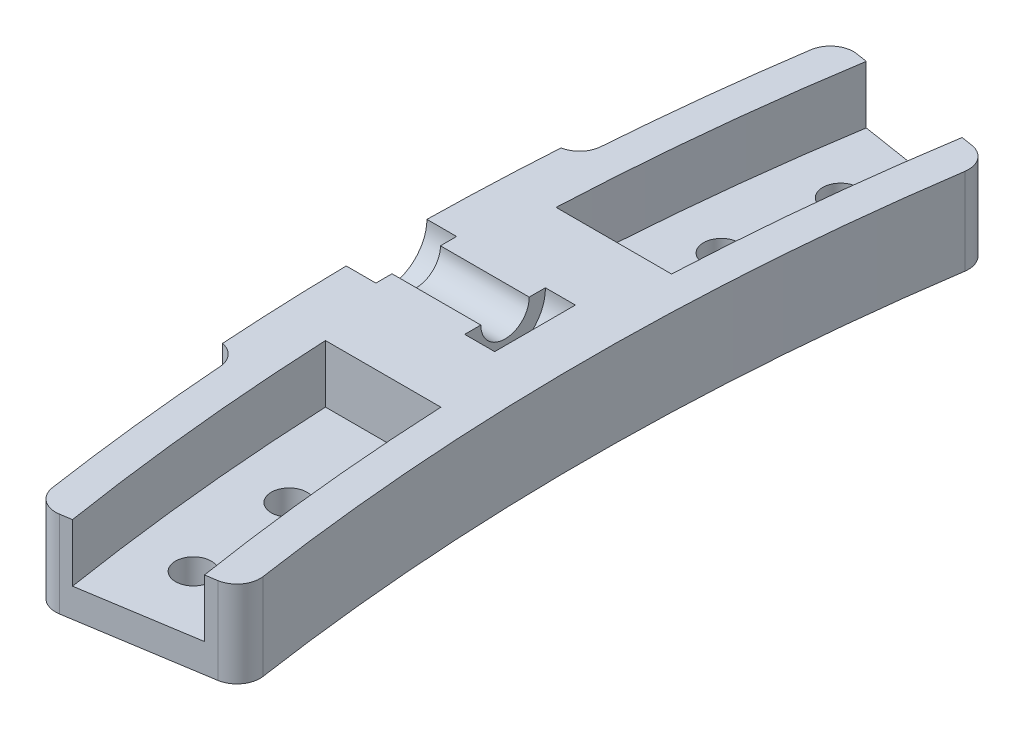
ISO-10303-21;
HEADER;
FILE_DESCRIPTION(('STEP AP214'),'2;1');
FILE_NAME('part.step','',(''),(''),'','','');
FILE_SCHEMA(('AUTOMOTIVE_DESIGN { 1 0 10303 214 1 1 1 1 }'));
ENDSEC;
DATA;
#1=APPLICATION_CONTEXT('core data for automotive mechanical design processes');
#2=APPLICATION_PROTOCOL_DEFINITION('international standard','automotive_design',2000,#1);
#3=PRODUCT_CONTEXT('',#1,'mechanical');
#4=PRODUCT('Part','Part','',(#3));
#5=PRODUCT_RELATED_PRODUCT_CATEGORY('part','',(#4));
#6=PRODUCT_DEFINITION_FORMATION('','',#4);
#7=PRODUCT_DEFINITION_CONTEXT('part definition',#1,'design');
#8=PRODUCT_DEFINITION('design','',#6,#7);
#9=PRODUCT_DEFINITION_SHAPE('','',#8);
#10=(LENGTH_UNIT() NAMED_UNIT(*) SI_UNIT(.MILLI.,.METRE.));
#11=(NAMED_UNIT(*) PLANE_ANGLE_UNIT() SI_UNIT($,.RADIAN.));
#12=(NAMED_UNIT(*) SI_UNIT($,.STERADIAN.) SOLID_ANGLE_UNIT());
#13=UNCERTAINTY_MEASURE_WITH_UNIT(LENGTH_MEASURE(1.E-05),#10,'distance_accuracy_value','');
#14=(GEOMETRIC_REPRESENTATION_CONTEXT(3) GLOBAL_UNCERTAINTY_ASSIGNED_CONTEXT((#13)) GLOBAL_UNIT_ASSIGNED_CONTEXT((#10,
#11,#12)) REPRESENTATION_CONTEXT('',''));
#15=CARTESIAN_POINT('',(0.,0.,0.));
#16=DIRECTION('',(0.,0.,1.));
#17=DIRECTION('',(1.,0.,0.));
#18=AXIS2_PLACEMENT_3D('',#15,#16,#17);
#19=CARTESIAN_POINT('',(0.,7.5,0.));
#20=DIRECTION('',(0.,1.,0.));
#21=DIRECTION('',(0.,0.,1.));
#22=AXIS2_PLACEMENT_3D('',#19,#20,#21);
#23=PLANE('',#22);
#24=CARTESIAN_POINT('',(0.,7.5,0.));
#25=DIRECTION('',(0.,1.,0.));
#26=DIRECTION('',(0.,0.,1.));
#27=AXIS2_PLACEMENT_3D('',#24,#25,#26);
#28=CIRCLE('',#27,224.5);
#29=CARTESIAN_POINT('',(-224.019328267066,7.5,-14.6830025121671));
#30=VERTEX_POINT('',#29);
#31=CARTESIAN_POINT('',(-224.472715491215,7.5,-3.5));
#32=VERTEX_POINT('',#31);
#33=EDGE_CURVE('E327',#30,#32,#28,.T.);
#34=ORIENTED_EDGE('',*,*,#33,.T.);
#35=DIRECTION('',(-1.,0.,0.));
#36=VECTOR('',#35,1.);
#37=CARTESIAN_POINT('',(-224.5,7.5,-3.5));
#38=LINE('',#37,#36);
#39=CARTESIAN_POINT('',(-221.9,7.5,-3.5));
#40=VERTEX_POINT('',#39);
#41=EDGE_CURVE('E220',#32,#40,#38,.F.);
#42=ORIENTED_EDGE('',*,*,#41,.T.);
#43=DIRECTION('',(0.,0.,1.));
#44=VECTOR('',#43,1.);
#45=CARTESIAN_POINT('',(-221.9,7.5,0.));
#46=LINE('',#45,#44);
#47=CARTESIAN_POINT('',(-221.9,7.5,-2.10000000000001));
#48=VERTEX_POINT('',#47);
#49=EDGE_CURVE('E221',#40,#48,#46,.T.);
#50=ORIENTED_EDGE('',*,*,#49,.T.);
#51=DIRECTION('',(1.,0.,0.));
#52=VECTOR('',#51,1.);
#53=CARTESIAN_POINT('',(-224.5,7.5,-2.10000000000001));
#54=LINE('',#53,#52);
#55=CARTESIAN_POINT('',(-214.200000000001,7.5,-2.10000000000001));
#56=VERTEX_POINT('',#55);
#57=EDGE_CURVE('E242',#56,#48,#54,.F.);
#58=ORIENTED_EDGE('',*,*,#57,.F.);
#59=DIRECTION('',(0.,0.,1.));
#60=VECTOR('',#59,1.);
#61=CARTESIAN_POINT('',(-214.2,7.5,5.26399215997816E-12));
#62=LINE('',#61,#60);
#63=CARTESIAN_POINT('',(-214.200000000001,7.5,-3.49947186729268));
#64=VERTEX_POINT('',#63);
#65=EDGE_CURVE('E241',#64,#56,#62,.T.);
#66=ORIENTED_EDGE('',*,*,#65,.F.);
#67=DIRECTION('',(1.,0.,0.));
#68=VECTOR('',#67,1.);
#69=CARTESIAN_POINT('',(-214.200000000001,7.5,-3.49947186729268));
#70=LINE('',#69,#68);
#71=CARTESIAN_POINT('',(-211.600000000001,7.5,-3.49947186729274));
#72=VERTEX_POINT('',#71);
#73=EDGE_CURVE('E424',#64,#72,#70,.T.);
#74=ORIENTED_EDGE('',*,*,#73,.T.);
#75=DIRECTION('',(0.,0.,1.));
#76=VECTOR('',#75,1.);
#77=CARTESIAN_POINT('',(-211.6,7.5,5.20009683030522E-12));
#78=LINE('',#77,#76);
#79=CARTESIAN_POINT('',(-211.6,7.5,3.49947186730315));
#80=VERTEX_POINT('',#79);
#81=EDGE_CURVE('E416',#72,#80,#78,.T.);
#82=ORIENTED_EDGE('',*,*,#81,.T.);
#83=DIRECTION('',(1.,0.,0.));
#84=VECTOR('',#83,1.);
#85=CARTESIAN_POINT('',(-214.2,7.5,3.49947186730321));
#86=LINE('',#85,#84);
#87=CARTESIAN_POINT('',(-214.2,7.5,3.49947186730321));
#88=VERTEX_POINT('',#87);
#89=EDGE_CURVE('E421',#80,#88,#86,.F.);
#90=ORIENTED_EDGE('',*,*,#89,.T.);
#91=CARTESIAN_POINT('',(-214.2,7.5,2.09999999999999));
#92=VERTEX_POINT('',#91);
#93=EDGE_CURVE('E237',#92,#88,#62,.T.);
#94=ORIENTED_EDGE('',*,*,#93,.F.);
#95=DIRECTION('',(1.,0.,0.));
#96=VECTOR('',#95,1.);
#97=CARTESIAN_POINT('',(-224.5,7.5,2.09999999999999));
#98=LINE('',#97,#96);
#99=CARTESIAN_POINT('',(-221.9,7.5,2.09999999999999));
#100=VERTEX_POINT('',#99);
#101=EDGE_CURVE('E229',#100,#92,#98,.T.);
#102=ORIENTED_EDGE('',*,*,#101,.F.);
#103=CARTESIAN_POINT('',(-221.9,7.5,3.49999999999995));
#104=VERTEX_POINT('',#103);
#105=EDGE_CURVE('E56',#100,#104,#46,.T.);
#106=ORIENTED_EDGE('',*,*,#105,.T.);
#107=DIRECTION('',(-1.,0.,0.));
#108=VECTOR('',#107,1.);
#109=CARTESIAN_POINT('',(-224.5,7.5,3.49999999999995));
#110=LINE('',#109,#108);
#111=CARTESIAN_POINT('',(-224.472715491215,7.5,3.49999999999995));
#112=VERTEX_POINT('',#111);
#113=EDGE_CURVE('E214',#104,#112,#110,.T.);
#114=ORIENTED_EDGE('',*,*,#113,.T.);
#115=CARTESIAN_POINT('',(-224.019328267066,7.5,14.6830025121672));
#116=VERTEX_POINT('',#115);
#117=EDGE_CURVE('E330',#112,#116,#28,.T.);
#118=ORIENTED_EDGE('',*,*,#117,.T.);
#119=CARTESIAN_POINT('',(-224.383131319015,7.5,16.6496360162551));
#120=DIRECTION('',(0.,1.,0.));
#121=DIRECTION('',(0.,0.,1.));
#122=AXIS2_PLACEMENT_3D('',#119,#120,#121);
#123=CIRCLE('',#122,2.);
#124=CARTESIAN_POINT('',(-222.388614596179,7.5,16.5016392516661));
#125=VERTEX_POINT('',#124);
#126=EDGE_CURVE('E64',#116,#125,#123,.F.);
#127=ORIENTED_EDGE('',*,*,#126,.T.);
#128=CARTESIAN_POINT('',(0.,7.5,0.));
#129=DIRECTION('',(0.,1.,0.));
#130=DIRECTION('',(0.,0.,1.));
#131=AXIS2_PLACEMENT_3D('',#128,#129,#130);
#132=CIRCLE('',#131,223.);
#133=CARTESIAN_POINT('',(-220.561180845032,7.5,32.8902037732362));
#134=VERTEX_POINT('',#133);
#135=EDGE_CURVE('E348',#125,#134,#132,.T.);
#136=ORIENTED_EDGE('',*,*,#135,.T.);
#137=CARTESIAN_POINT('',(-218.583053662566,7.5,32.5952243671982));
#138=DIRECTION('',(0.,1.,0.));
#139=DIRECTION('',(0.,0.,1.));
#140=AXIS2_PLACEMENT_3D('',#137,#138,#139);
#141=CIRCLE('',#140,2.);
#142=CARTESIAN_POINT('',(-218.270184732485,7.5,34.5706010483885));
#143=VERTEX_POINT('',#142);
#144=EDGE_CURVE('E383',#134,#143,#141,.T.);
#145=ORIENTED_EDGE('',*,*,#144,.T.);
#146=DIRECTION('',(-0.987688340595137,0.,0.156434465040234));
#147=VECTOR('',#146,1.);
#148=CARTESIAN_POINT('',(0.,7.5,0.));
#149=LINE('',#148,#147);
#150=CARTESIAN_POINT('',(-217.29143493093,7.5,34.4155823088514));
#151=VERTEX_POINT('',#150);
#152=EDGE_CURVE('E342',#151,#143,#149,.T.);
#153=ORIENTED_EDGE('',*,*,#152,.F.);
#154=CARTESIAN_POINT('',(0.,7.5,0.));
#155=DIRECTION('',(0.,1.,0.));
#156=DIRECTION('',(0.,0.,1.));
#157=AXIS2_PLACEMENT_3D('',#154,#155,#156);
#158=CIRCLE('',#157,220.);
#159=CARTESIAN_POINT('',(-219.772609758359,7.5,10.));
#160=VERTEX_POINT('',#159);
#161=EDGE_CURVE('E314',#160,#151,#158,.T.);
#162=ORIENTED_EDGE('',*,*,#161,.F.);
#163=DIRECTION('',(-1.,0.,0.));
#164=VECTOR('',#163,1.);
#165=CARTESIAN_POINT('',(0.,7.5,10.));
#166=LINE('',#165,#164);
#167=CARTESIAN_POINT('',(-209.76176963403,7.5,10.));
#168=VERTEX_POINT('',#167);
#169=EDGE_CURVE('E312',#168,#160,#166,.T.);
#170=ORIENTED_EDGE('',*,*,#169,.F.);
#171=CARTESIAN_POINT('',(0.,7.5,0.));
#172=DIRECTION('',(0.,1.,0.));
#173=DIRECTION('',(0.,0.,1.));
#174=AXIS2_PLACEMENT_3D('',#171,#172,#173);
#175=CIRCLE('',#174,210.);
#176=CARTESIAN_POINT('',(-207.414551524979,7.5,32.8512376584491));
#177=VERTEX_POINT('',#176);
#178=EDGE_CURVE('E303',#168,#177,#175,.T.);
#179=ORIENTED_EDGE('',*,*,#178,.T.);
#180=CARTESIAN_POINT('',(-206.417411404929,7.5,32.6933061786099));
#181=VERTEX_POINT('',#180);
#182=EDGE_CURVE('E339',#181,#177,#149,.T.);
#183=ORIENTED_EDGE('',*,*,#182,.F.);
#184=CARTESIAN_POINT('',(-206.730280335009,7.5,30.7179294974196));
#185=DIRECTION('',(0.,1.,0.));
#186=DIRECTION('',(0.,0.,1.));
#187=AXIS2_PLACEMENT_3D('',#184,#185,#186);
#188=CIRCLE('',#187,2.);
#189=CARTESIAN_POINT('',(-204.752000140416,7.5,30.4239780189754));
#190=VERTEX_POINT('',#189);
#191=EDGE_CURVE('E385',#181,#190,#188,.T.);
#192=ORIENTED_EDGE('',*,*,#191,.T.);
#193=CARTESIAN_POINT('',(0.,7.5,0.));
#194=DIRECTION('',(0.,1.,0.));
#195=DIRECTION('',(0.,0.,1.));
#196=AXIS2_PLACEMENT_3D('',#193,#194,#195);
#197=CIRCLE('',#196,207.);
#198=CARTESIAN_POINT('',(-204.752000140416,7.5,-30.4239780189754));
#199=VERTEX_POINT('',#198);
#200=EDGE_CURVE('E341',#199,#190,#197,.T.);
#201=ORIENTED_EDGE('',*,*,#200,.F.);
#202=CARTESIAN_POINT('',(-206.730280335009,7.5,-30.7179294974196));
#203=DIRECTION('',(0.,1.,0.));
#204=DIRECTION('',(0.,0.,1.));
#205=AXIS2_PLACEMENT_3D('',#202,#203,#204);
#206=CIRCLE('',#205,2.);
#207=CARTESIAN_POINT('',(-206.417411404929,7.5,-32.6933061786099));
#208=VERTEX_POINT('',#207);
#209=EDGE_CURVE('E387',#199,#208,#206,.T.);
#210=ORIENTED_EDGE('',*,*,#209,.T.);
#211=DIRECTION('',(0.987688340595137,0.,0.156434465040234));
#212=VECTOR('',#211,1.);
#213=CARTESIAN_POINT('',(0.,7.5,0.));
#214=LINE('',#213,#212);
#215=CARTESIAN_POINT('',(-207.414551524979,7.5,-32.8512376584492));
#216=VERTEX_POINT('',#215);
#217=EDGE_CURVE('E345',#216,#208,#214,.T.);
#218=ORIENTED_EDGE('',*,*,#217,.F.);
#219=CARTESIAN_POINT('',(0.,7.5,0.));
#220=DIRECTION('',(0.,1.,0.));
#221=DIRECTION('',(0.,0.,1.));
#222=AXIS2_PLACEMENT_3D('',#219,#220,#221);
#223=CIRCLE('',#222,210.);
#224=CARTESIAN_POINT('',(-209.76176963403,7.5,-9.99999999999998));
#225=VERTEX_POINT('',#224);
#226=EDGE_CURVE('E272',#216,#225,#223,.T.);
#227=ORIENTED_EDGE('',*,*,#226,.T.);
#228=DIRECTION('',(-1.,0.,0.));
#229=VECTOR('',#228,1.);
#230=CARTESIAN_POINT('',(0.,7.5,-10.));
#231=LINE('',#230,#229);
#232=CARTESIAN_POINT('',(-219.772609758359,7.5,-9.99999999999997));
#233=VERTEX_POINT('',#232);
#234=EDGE_CURVE('E283',#225,#233,#231,.T.);
#235=ORIENTED_EDGE('',*,*,#234,.T.);
#236=CARTESIAN_POINT('',(0.,7.5,0.));
#237=DIRECTION('',(0.,1.,0.));
#238=DIRECTION('',(0.,0.,1.));
#239=AXIS2_PLACEMENT_3D('',#236,#237,#238);
#240=CIRCLE('',#239,220.);
#241=CARTESIAN_POINT('',(-217.29143493093,7.5,-34.4155823088514));
#242=VERTEX_POINT('',#241);
#243=EDGE_CURVE('E280',#242,#233,#240,.T.);
#244=ORIENTED_EDGE('',*,*,#243,.F.);
#245=CARTESIAN_POINT('',(-218.270184732485,7.5,-34.5706010483885));
#246=VERTEX_POINT('',#245);
#247=EDGE_CURVE('E346',#246,#242,#214,.T.);
#248=ORIENTED_EDGE('',*,*,#247,.F.);
#249=CARTESIAN_POINT('',(-218.583053662566,7.5,-32.5952243671982));
#250=DIRECTION('',(0.,1.,0.));
#251=DIRECTION('',(0.,0.,1.));
#252=AXIS2_PLACEMENT_3D('',#249,#250,#251);
#253=CIRCLE('',#252,2.);
#254=CARTESIAN_POINT('',(-220.561180845032,7.5,-32.8902037732362));
#255=VERTEX_POINT('',#254);
#256=EDGE_CURVE('E389',#246,#255,#253,.T.);
#257=ORIENTED_EDGE('',*,*,#256,.T.);
#258=CARTESIAN_POINT('',(-222.388614596179,7.5,-16.5016392516641));
#259=VERTEX_POINT('',#258);
#260=EDGE_CURVE('E349',#255,#259,#132,.T.);
#261=ORIENTED_EDGE('',*,*,#260,.T.);
#262=CARTESIAN_POINT('',(-224.383131319015,7.5,-16.649636016253));
#263=DIRECTION('',(0.,1.,0.));
#264=DIRECTION('',(0.,0.,1.));
#265=AXIS2_PLACEMENT_3D('',#262,#263,#264);
#266=CIRCLE('',#265,2.);
#267=EDGE_CURVE('E411',#259,#30,#266,.F.);
#268=ORIENTED_EDGE('',*,*,#267,.T.);
#269=EDGE_LOOP('',(#34,#42,#50,#58,#66,#74,#82,#90,#94,#102,#106,#114,#118,#127,#136,#145,#153,
#162,#170,#179,#183,#192,#201,#210,#218,#227,#235,#244,#248,#257,#261,#268));
#270=FACE_BOUND('',#269,.T.);
#271=ADVANCED_FACE('F35',(#270),#23,.T.);
#272=CARTESIAN_POINT('',(0.,7.5,0.));
#273=DIRECTION('',(0.,-1.,0.));
#274=DIRECTION('',(0.,0.,-1.));
#275=AXIS2_PLACEMENT_3D('',#272,#273,#274);
#276=CYLINDRICAL_SURFACE('',#275,224.5);
#277=CARTESIAN_POINT('',(-224.472715491215,7.5,-3.5));
#278=CARTESIAN_POINT('',(-224.472714861712,7.40156578840338,-3.50000943737716));
#279=CARTESIAN_POINT('',(-224.472780225117,7.30313605810773,-3.49584747938354));
#280=CARTESIAN_POINT('',(-224.473038289765,7.1069809173122,-3.47925381156051));
#281=CARTESIAN_POINT('',(-224.473230984854,7.00925547300403,-3.46682250139931));
#282=CARTESIAN_POINT('',(-224.473738885951,6.8152632798036,-3.43377485265587));
#283=CARTESIAN_POINT('',(-224.474054005164,6.71899554756869,-3.41316431264958));
#284=CARTESIAN_POINT('',(-224.474797261434,6.52856227230528,-3.36392550562658));
#285=CARTESIAN_POINT('',(-224.475225397129,6.43439670394645,-3.33529733527587));
#286=CARTESIAN_POINT('',(-224.476662783917,6.15596524404037,-3.23761897666636));
#287=CARTESIAN_POINT('',(-224.477825245954,5.97568200368354,-3.15676079513716));
#288=CARTESIAN_POINT('',(-224.480426703749,5.63138518923722,-2.96598425473683));
#289=CARTESIAN_POINT('',(-224.48186564567,5.46736845712206,-2.85607155183975));
#290=CARTESIAN_POINT('',(-224.484858395544,5.16006978767687,-2.61025296217331));
#291=CARTESIAN_POINT('',(-224.486412214712,5.01678987859334,-2.47434453580414));
#292=CARTESIAN_POINT('',(-224.489459632982,4.75506499986371,-2.18038409126836));
#293=CARTESIAN_POINT('',(-224.490953222877,4.63662381547568,-2.02232870416418));
#294=CARTESIAN_POINT('',(-224.493711562528,4.42795602564903,-1.68857247177381));
#295=CARTESIAN_POINT('',(-224.494976310728,4.33772961211474,-1.51287150648099));
#296=CARTESIAN_POINT('',(-224.497134279755,4.18806213664848,-1.14882485480166));
#297=CARTESIAN_POINT('',(-224.498027524533,4.12861909003653,-0.960479984483705));
#298=CARTESIAN_POINT('',(-224.499341856259,4.04220007556948,-0.576494033295444));
#299=CARTESIAN_POINT('',(-224.499762972449,4.01522209692809,-0.380853405075797));
#300=CARTESIAN_POINT('',(-224.500085673098,3.99449295010015,0.0121851581695343));
#301=CARTESIAN_POINT('',(-224.499987245918,4.00074252625487,0.209583132463209));
#302=CARTESIAN_POINT('',(-224.499281965034,4.04629033944203,0.600508238712191));
#303=CARTESIAN_POINT('',(-224.498675160583,4.08558537482803,0.794035743802673));
#304=CARTESIAN_POINT('',(-224.497021592075,4.1961036468751,1.17174593250207));
#305=CARTESIAN_POINT('',(-224.495974829285,4.2673267915241,1.35592864303959));
#306=CARTESIAN_POINT('',(-224.493559239443,4.43968478895615,1.70973551861152));
#307=CARTESIAN_POINT('',(-224.492190389736,4.54082174598735,1.87935865838854));
#308=CARTESIAN_POINT('',(-224.489285031404,4.77012988756459,2.19921078253235));
#309=CARTESIAN_POINT('',(-224.487748530898,4.89829976292092,2.34944070553442));
#310=CARTESIAN_POINT('',(-224.484681028317,5.17803246732865,2.62624976845429));
#311=CARTESIAN_POINT('',(-224.483150026089,5.32959464646475,2.75282956523463));
#312=CARTESIAN_POINT('',(-224.480265583076,5.65187883091554,2.97878840736272));
#313=CARTESIAN_POINT('',(-224.478912198826,5.82260690456416,3.07815880318588));
#314=CARTESIAN_POINT('',(-224.476535449462,6.17839774925335,3.24687297259607));
#315=CARTESIAN_POINT('',(-224.475512286168,6.36346920112557,3.31619839255343));
#316=CARTESIAN_POINT('',(-224.473914065314,6.74248187923013,3.4226871967959));
#317=CARTESIAN_POINT('',(-224.473338323597,6.93640908134263,3.45989969487161));
#318=CARTESIAN_POINT('',(-224.472916934368,7.19302192271803,3.48705818759328));
#319=CARTESIAN_POINT('',(-224.472841431698,7.25437105769747,3.49191392810576));
#320=CARTESIAN_POINT('',(-224.472740777511,7.37713851009347,3.49838040408815));
#321=CARTESIAN_POINT('',(-224.472715542936,7.4385565453343,3.49999649249394));
#322=CARTESIAN_POINT('',(-224.472715491215,7.5,3.49999999999995));
#323=B_SPLINE_CURVE_WITH_KNOTS('',3,(#277,#278,#279,#280,#281,#282,#283,#284,#285,#286,#287,
#288,#289,#290,#291,#292,#293,#294,#295,#296,#297,#298,#299,#300,#301,#302,#303,#304,#305,#306,
#307,#308,#309,#310,#311,#312,#313,#314,#315,#316,#317,#318,#319,#320,#321,#322),.UNSPECIFIED.,
.F.,.F.,(4,2,2,2,2,2,2,2,2,2,2,2,2,2,2,2,2,2,2,2,2,2,4),(0.,0.29520657625106,0.590398885833,
0.885382294826047,1.18036214745175,1.77007362886811,2.35967039699536,2.94932479403663,
3.53906898533124,4.12881718771663,4.71852736283831,5.30820101124837,5.89788786918531,
6.48751760122972,7.07714563405961,7.6668151533735,8.25645612186404,8.84608071113289,
9.43589251757687,10.0260641173299,10.6153314954947,10.7998949857025,10.9841532661159),.UNSPECIFIED.);
#324=EDGE_CURVE('E11',#32,#112,#323,.T.);
#325=ORIENTED_EDGE('',*,*,#324,.F.);
#326=ORIENTED_EDGE('',*,*,#33,.F.);
#327=DIRECTION('',(0.,-1.,0.));
#328=VECTOR('',#327,1.);
#329=CARTESIAN_POINT('',(-224.019328267066,7.5,-14.6830025121671));
#330=LINE('',#329,#328);
#331=CARTESIAN_POINT('',(-224.019328267066,0.,-14.6830025121671));
#332=VERTEX_POINT('',#331);
#333=EDGE_CURVE('E329',#30,#332,#330,.T.);
#334=ORIENTED_EDGE('',*,*,#333,.T.);
#335=CARTESIAN_POINT('',(0.,0.,0.));
#336=DIRECTION('',(0.,1.,0.));
#337=DIRECTION('',(0.,0.,1.));
#338=AXIS2_PLACEMENT_3D('',#335,#336,#337);
#339=CIRCLE('',#338,224.5);
#340=CARTESIAN_POINT('',(-224.019328267066,0.,14.6830025121672));
#341=VERTEX_POINT('',#340);
#342=EDGE_CURVE('E292',#332,#341,#339,.T.);
#343=ORIENTED_EDGE('',*,*,#342,.T.);
#344=DIRECTION('',(0.,-1.,0.));
#345=VECTOR('',#344,1.);
#346=CARTESIAN_POINT('',(-224.019328267066,7.5,14.6830025121672));
#347=LINE('',#346,#345);
#348=EDGE_CURVE('E335',#116,#341,#347,.T.);
#349=ORIENTED_EDGE('',*,*,#348,.F.);
#350=ORIENTED_EDGE('',*,*,#117,.F.);
#351=EDGE_LOOP('',(#325,#326,#334,#343,#349,#350));
#352=FACE_BOUND('',#351,.T.);
#353=ADVANCED_FACE('F451',(#352),#276,.T.);
#354=CARTESIAN_POINT('',(-224.5,7.5,0.));
#355=DIRECTION('',(1.,0.,0.));
#356=DIRECTION('',(0.,0.,-1.));
#357=AXIS2_PLACEMENT_3D('',#354,#355,#356);
#358=CYLINDRICAL_SURFACE('',#357,2.1);
#359=CARTESIAN_POINT('',(-221.9,7.5,0.));
#360=DIRECTION('',(-1.,0.,0.));
#361=DIRECTION('',(0.,0.,1.));
#362=AXIS2_PLACEMENT_3D('',#359,#360,#361);
#363=CIRCLE('',#362,2.1);
#364=EDGE_CURVE('E49',#100,#48,#363,.F.);
#365=ORIENTED_EDGE('',*,*,#364,.F.);
#366=ORIENTED_EDGE('',*,*,#101,.T.);
#367=CARTESIAN_POINT('',(-214.2,7.5,0.));
#368=DIRECTION('',(-1.,0.,0.));
#369=DIRECTION('',(0.,0.,1.));
#370=AXIS2_PLACEMENT_3D('',#367,#368,#369);
#371=CIRCLE('',#370,2.1);
#372=EDGE_CURVE('E418',#92,#56,#371,.F.);
#373=ORIENTED_EDGE('',*,*,#372,.T.);
#374=ORIENTED_EDGE('',*,*,#57,.T.);
#375=EDGE_LOOP('',(#365,#366,#373,#374));
#376=FACE_BOUND('',#375,.T.);
#377=ADVANCED_FACE('F429',(#376),#358,.F.);
#378=CARTESIAN_POINT('',(0.,7.5,0.));
#379=DIRECTION('',(0.156434465040234,0.,0.987688340595137));
#380=DIRECTION('',(0.987688340595137,0.,-0.156434465040234));
#381=AXIS2_PLACEMENT_3D('',#378,#379,#380);
#382=PLANE('',#381);
#383=DIRECTION('',(-0.987688340595137,0.,0.156434465040234));
#384=VECTOR('',#383,1.);
#385=CARTESIAN_POINT('',(0.,0.,0.));
#386=LINE('',#385,#384);
#387=CARTESIAN_POINT('',(-206.417411404929,0.,32.6933061786099));
#388=VERTEX_POINT('',#387);
#389=CARTESIAN_POINT('',(-218.270184732485,0.,34.5706010483885));
#390=VERTEX_POINT('',#389);
#391=EDGE_CURVE('E338',#388,#390,#386,.T.);
#392=ORIENTED_EDGE('',*,*,#391,.F.);
#393=DIRECTION('',(0.,-1.,0.));
#394=VECTOR('',#393,1.);
#395=CARTESIAN_POINT('',(-206.417411404929,7.5,32.6933061786099));
#396=LINE('',#395,#394);
#397=EDGE_CURVE('E399',#388,#181,#396,.F.);
#398=ORIENTED_EDGE('',*,*,#397,.T.);
#399=ORIENTED_EDGE('',*,*,#182,.T.);
#400=DIRECTION('',(0.,1.,0.));
#401=VECTOR('',#400,1.);
#402=CARTESIAN_POINT('',(-207.414551524979,2.5,32.8512376584491));
#403=LINE('',#402,#401);
#404=CARTESIAN_POINT('',(-207.414551524979,2.5,32.8512376584491));
#405=VERTEX_POINT('',#404);
#406=EDGE_CURVE('E319',#405,#177,#403,.T.);
#407=ORIENTED_EDGE('',*,*,#406,.F.);
#408=DIRECTION('',(0.987688340595137,0.,-0.156434465040234));
#409=VECTOR('',#408,1.);
#410=CARTESIAN_POINT('',(0.,2.5,0.));
#411=LINE('',#410,#409);
#412=CARTESIAN_POINT('',(-217.29143493093,2.5,34.4155823088514));
#413=VERTEX_POINT('',#412);
#414=EDGE_CURVE('E306',#413,#405,#411,.T.);
#415=ORIENTED_EDGE('',*,*,#414,.F.);
#416=DIRECTION('',(0.,1.,0.));
#417=VECTOR('',#416,1.);
#418=CARTESIAN_POINT('',(-217.29143493093,2.5,34.4155823088514));
#419=LINE('',#418,#417);
#420=EDGE_CURVE('E322',#413,#151,#419,.T.);
#421=ORIENTED_EDGE('',*,*,#420,.T.);
#422=ORIENTED_EDGE('',*,*,#152,.T.);
#423=DIRECTION('',(0.,1.,0.));
#424=VECTOR('',#423,1.);
#425=CARTESIAN_POINT('',(-218.270184732485,0.,34.5706010483885));
#426=LINE('',#425,#424);
#427=EDGE_CURVE('E396',#143,#390,#426,.F.);
#428=ORIENTED_EDGE('',*,*,#427,.T.);
#429=EDGE_LOOP('',(#392,#398,#399,#407,#415,#421,#422,#428));
#430=FACE_BOUND('',#429,.T.);
#431=ADVANCED_FACE('F475',(#430),#382,.T.);
#432=CARTESIAN_POINT('',(0.,7.5,0.));
#433=DIRECTION('',(0.156434465040234,0.,-0.987688340595137));
#434=DIRECTION('',(-0.987688340595137,0.,-0.156434465040234));
#435=AXIS2_PLACEMENT_3D('',#432,#433,#434);
#436=PLANE('',#435);
#437=DIRECTION('',(0.987688340595137,0.,0.156434465040234));
#438=VECTOR('',#437,1.);
#439=CARTESIAN_POINT('',(0.,0.,0.));
#440=LINE('',#439,#438);
#441=CARTESIAN_POINT('',(-218.270184732485,0.,-34.5706010483885));
#442=VERTEX_POINT('',#441);
#443=CARTESIAN_POINT('',(-206.417411404929,0.,-32.6933061786099));
#444=VERTEX_POINT('',#443);
#445=EDGE_CURVE('E358',#442,#444,#440,.T.);
#446=ORIENTED_EDGE('',*,*,#445,.F.);
#447=DIRECTION('',(0.,1.,0.));
#448=VECTOR('',#447,1.);
#449=CARTESIAN_POINT('',(-218.270184732485,7.5,-34.5706010483885));
#450=LINE('',#449,#448);
#451=EDGE_CURVE('E381',#442,#246,#450,.T.);
#452=ORIENTED_EDGE('',*,*,#451,.T.);
#453=ORIENTED_EDGE('',*,*,#247,.T.);
#454=DIRECTION('',(0.,1.,0.));
#455=VECTOR('',#454,1.);
#456=CARTESIAN_POINT('',(-217.291434930931,2.5,-34.4155823088515));
#457=LINE('',#456,#455);
#458=CARTESIAN_POINT('',(-217.291434930931,2.5,-34.4155823088515));
#459=VERTEX_POINT('',#458);
#460=EDGE_CURVE('E279',#459,#242,#457,.T.);
#461=ORIENTED_EDGE('',*,*,#460,.F.);
#462=DIRECTION('',(-0.987688340595137,0.,-0.156434465040234));
#463=VECTOR('',#462,1.);
#464=CARTESIAN_POINT('',(0.,2.5,0.));
#465=LINE('',#464,#463);
#466=CARTESIAN_POINT('',(-207.414551524979,2.5,-32.8512376584492));
#467=VERTEX_POINT('',#466);
#468=EDGE_CURVE('E268',#467,#459,#465,.T.);
#469=ORIENTED_EDGE('',*,*,#468,.F.);
#470=DIRECTION('',(0.,1.,0.));
#471=VECTOR('',#470,1.);
#472=CARTESIAN_POINT('',(-207.414551524979,2.5,-32.8512376584492));
#473=LINE('',#472,#471);
#474=EDGE_CURVE('E289',#467,#216,#473,.T.);
#475=ORIENTED_EDGE('',*,*,#474,.T.);
#476=ORIENTED_EDGE('',*,*,#217,.T.);
#477=DIRECTION('',(0.,-1.,0.));
#478=VECTOR('',#477,1.);
#479=CARTESIAN_POINT('',(-206.417411404929,7.5,-32.6933061786099));
#480=LINE('',#479,#478);
#481=EDGE_CURVE('E378',#208,#444,#480,.T.);
#482=ORIENTED_EDGE('',*,*,#481,.T.);
#483=EDGE_LOOP('',(#446,#452,#453,#461,#469,#475,#476,#482));
#484=FACE_BOUND('',#483,.T.);
#485=ADVANCED_FACE('F471',(#484),#436,.T.);
#486=CARTESIAN_POINT('',(0.,7.5,0.));
#487=DIRECTION('',(0.,-1.,0.));
#488=DIRECTION('',(0.,0.,-1.));
#489=AXIS2_PLACEMENT_3D('',#486,#487,#488);
#490=CYLINDRICAL_SURFACE('',#489,223.);
#491=ORIENTED_EDGE('',*,*,#135,.F.);
#492=DIRECTION('',(0.,-1.,0.));
#493=VECTOR('',#492,1.);
#494=CARTESIAN_POINT('',(-222.388614596179,7.5,16.5016392516661));
#495=LINE('',#494,#493);
#496=CARTESIAN_POINT('',(-222.388614596179,0.,16.5016392516661));
#497=VERTEX_POINT('',#496);
#498=EDGE_CURVE('E406',#125,#497,#495,.T.);
#499=ORIENTED_EDGE('',*,*,#498,.T.);
#500=CARTESIAN_POINT('',(0.,0.,0.));
#501=DIRECTION('',(0.,1.,0.));
#502=DIRECTION('',(0.,0.,1.));
#503=AXIS2_PLACEMENT_3D('',#500,#501,#502);
#504=CIRCLE('',#503,223.);
#505=CARTESIAN_POINT('',(-220.561180845032,0.,32.8902037732362));
#506=VERTEX_POINT('',#505);
#507=EDGE_CURVE('E361',#497,#506,#504,.T.);
#508=ORIENTED_EDGE('',*,*,#507,.T.);
#509=DIRECTION('',(0.,-1.,0.));
#510=VECTOR('',#509,1.);
#511=CARTESIAN_POINT('',(-220.561180845032,7.5,32.8902037732362));
#512=LINE('',#511,#510);
#513=EDGE_CURVE('E401',#506,#134,#512,.F.);
#514=ORIENTED_EDGE('',*,*,#513,.T.);
#515=EDGE_LOOP('',(#491,#499,#508,#514));
#516=FACE_BOUND('',#515,.T.);
#517=ADVANCED_FACE('F467',(#516),#490,.T.);
#518=CARTESIAN_POINT('',(-220.561180845032,0.,-32.8902037732362));
#519=VERTEX_POINT('',#518);
#520=CARTESIAN_POINT('',(-222.388614596179,0.,-16.5016392516641));
#521=VERTEX_POINT('',#520);
#522=EDGE_CURVE('E362',#519,#521,#504,.T.);
#523=ORIENTED_EDGE('',*,*,#522,.T.);
#524=DIRECTION('',(0.,-1.,0.));
#525=VECTOR('',#524,1.);
#526=CARTESIAN_POINT('',(-222.388614596179,7.5,-16.5016392516641));
#527=LINE('',#526,#525);
#528=EDGE_CURVE('E404',#521,#259,#527,.F.);
#529=ORIENTED_EDGE('',*,*,#528,.T.);
#530=ORIENTED_EDGE('',*,*,#260,.F.);
#531=DIRECTION('',(0.,-1.,0.));
#532=VECTOR('',#531,1.);
#533=CARTESIAN_POINT('',(-220.561180845032,7.5,-32.8902037732362));
#534=LINE('',#533,#532);
#535=EDGE_CURVE('E352',#255,#519,#534,.T.);
#536=ORIENTED_EDGE('',*,*,#535,.T.);
#537=EDGE_LOOP('',(#523,#529,#530,#536));
#538=FACE_BOUND('',#537,.T.);
#539=ADVANCED_FACE('F470',(#538),#490,.T.);
#540=CARTESIAN_POINT('',(0.,7.5,0.));
#541=DIRECTION('',(0.,-1.,0.));
#542=DIRECTION('',(0.,0.,-1.));
#543=AXIS2_PLACEMENT_3D('',#540,#541,#542);
#544=CYLINDRICAL_SURFACE('',#543,207.);
#545=CARTESIAN_POINT('',(0.,0.,0.));
#546=DIRECTION('',(0.,1.,0.));
#547=DIRECTION('',(0.,0.,1.));
#548=AXIS2_PLACEMENT_3D('',#545,#546,#547);
#549=CIRCLE('',#548,207.);
#550=CARTESIAN_POINT('',(-204.752000140416,0.,-30.4239780189754));
#551=VERTEX_POINT('',#550);
#552=CARTESIAN_POINT('',(-204.752000140416,0.,30.4239780189754));
#553=VERTEX_POINT('',#552);
#554=EDGE_CURVE('E355',#551,#553,#549,.T.);
#555=ORIENTED_EDGE('',*,*,#554,.F.);
#556=DIRECTION('',(0.,-1.,0.));
#557=VECTOR('',#556,1.);
#558=CARTESIAN_POINT('',(-204.752000140416,7.5,-30.4239780189754));
#559=LINE('',#558,#557);
#560=EDGE_CURVE('E394',#551,#199,#559,.F.);
#561=ORIENTED_EDGE('',*,*,#560,.T.);
#562=ORIENTED_EDGE('',*,*,#200,.T.);
#563=DIRECTION('',(0.,-1.,0.));
#564=VECTOR('',#563,1.);
#565=CARTESIAN_POINT('',(-204.752000140416,7.5,30.4239780189754));
#566=LINE('',#565,#564);
#567=EDGE_CURVE('E391',#190,#553,#566,.T.);
#568=ORIENTED_EDGE('',*,*,#567,.T.);
#569=EDGE_LOOP('',(#555,#561,#562,#568));
#570=FACE_BOUND('',#569,.T.);
#571=ADVANCED_FACE('F465',(#570),#544,.F.);
#572=CARTESIAN_POINT('',(0.,0.,0.));
#573=DIRECTION('',(0.,1.,0.));
#574=DIRECTION('',(0.,0.,1.));
#575=AXIS2_PLACEMENT_3D('',#572,#573,#574);
#576=PLANE('',#575);
#577=CARTESIAN_POINT('',(-213.160645195369,0.,28.0631313273113));
#578=DIRECTION('',(0.,-1.,0.));
#579=DIRECTION('',(0.,0.,-1.));
#580=AXIS2_PLACEMENT_3D('',#577,#578,#579);
#581=CIRCLE('',#580,1.55);
#582=CARTESIAN_POINT('',(-213.160645195369,0.,26.5131313273113));
#583=VERTEX_POINT('',#582);
#584=EDGE_CURVE('E246',#583,#583,#581,.T.);
#585=ORIENTED_EDGE('',*,*,#584,.F.);
#586=EDGE_LOOP('',(#585));
#587=FACE_BOUND('',#586,.T.);
#588=CARTESIAN_POINT('',(-214.181860089725,0.,18.7384846907466));
#589=DIRECTION('',(0.,-1.,0.));
#590=DIRECTION('',(0.,0.,-1.));
#591=AXIS2_PLACEMENT_3D('',#588,#589,#590);
#592=CIRCLE('',#591,1.55);
#593=CARTESIAN_POINT('',(-214.181860089725,0.,17.1884846907466));
#594=VERTEX_POINT('',#593);
#595=EDGE_CURVE('E252',#594,#594,#592,.T.);
#596=ORIENTED_EDGE('',*,*,#595,.F.);
#597=EDGE_LOOP('',(#596));
#598=FACE_BOUND('',#597,.T.);
#599=CARTESIAN_POINT('',(-214.181860089725,0.,-18.7384846907465));
#600=DIRECTION('',(0.,-1.,0.));
#601=DIRECTION('',(0.,0.,-1.));
#602=AXIS2_PLACEMENT_3D('',#599,#600,#601);
#603=CIRCLE('',#602,1.55);
#604=CARTESIAN_POINT('',(-214.181860089725,0.,-20.2884846907465));
#605=VERTEX_POINT('',#604);
#606=EDGE_CURVE('E258',#605,#605,#603,.T.);
#607=ORIENTED_EDGE('',*,*,#606,.F.);
#608=EDGE_LOOP('',(#607));
#609=FACE_BOUND('',#608,.T.);
#610=CARTESIAN_POINT('',(-213.160645195369,0.,-28.0631313273113));
#611=DIRECTION('',(0.,-1.,0.));
#612=DIRECTION('',(0.,0.,-1.));
#613=AXIS2_PLACEMENT_3D('',#610,#611,#612);
#614=CIRCLE('',#613,1.55);
#615=CARTESIAN_POINT('',(-213.160645195369,0.,-29.6131313273112));
#616=VERTEX_POINT('',#615);
#617=EDGE_CURVE('E264',#616,#616,#614,.T.);
#618=ORIENTED_EDGE('',*,*,#617,.F.);
#619=EDGE_LOOP('',(#618));
#620=FACE_BOUND('',#619,.T.);
#621=ORIENTED_EDGE('',*,*,#522,.F.);
#622=CARTESIAN_POINT('',(-218.583053662566,0.,-32.5952243671982));
#623=DIRECTION('',(0.,1.,0.));
#624=DIRECTION('',(0.,0.,1.));
#625=AXIS2_PLACEMENT_3D('',#622,#623,#624);
#626=CIRCLE('',#625,2.);
#627=EDGE_CURVE('E376',#519,#442,#626,.F.);
#628=ORIENTED_EDGE('',*,*,#627,.T.);
#629=ORIENTED_EDGE('',*,*,#445,.T.);
#630=CARTESIAN_POINT('',(-206.730280335009,0.,-30.7179294974196));
#631=DIRECTION('',(0.,1.,0.));
#632=DIRECTION('',(0.,0.,1.));
#633=AXIS2_PLACEMENT_3D('',#630,#631,#632);
#634=CIRCLE('',#633,2.);
#635=EDGE_CURVE('E374',#444,#551,#634,.F.);
#636=ORIENTED_EDGE('',*,*,#635,.T.);
#637=ORIENTED_EDGE('',*,*,#554,.T.);
#638=CARTESIAN_POINT('',(-206.730280335009,0.,30.7179294974196));
#639=DIRECTION('',(0.,1.,0.));
#640=DIRECTION('',(0.,0.,1.));
#641=AXIS2_PLACEMENT_3D('',#638,#639,#640);
#642=CIRCLE('',#641,2.);
#643=EDGE_CURVE('E372',#553,#388,#642,.F.);
#644=ORIENTED_EDGE('',*,*,#643,.T.);
#645=ORIENTED_EDGE('',*,*,#391,.T.);
#646=CARTESIAN_POINT('',(-218.583053662566,0.,32.5952243671982));
#647=DIRECTION('',(0.,1.,0.));
#648=DIRECTION('',(0.,0.,1.));
#649=AXIS2_PLACEMENT_3D('',#646,#647,#648);
#650=CIRCLE('',#649,2.);
#651=EDGE_CURVE('E369',#390,#506,#650,.F.);
#652=ORIENTED_EDGE('',*,*,#651,.T.);
#653=ORIENTED_EDGE('',*,*,#507,.F.);
#654=CARTESIAN_POINT('',(-224.383131319015,0.,16.6496360162551));
#655=DIRECTION('',(0.,1.,0.));
#656=DIRECTION('',(0.,0.,1.));
#657=AXIS2_PLACEMENT_3D('',#654,#655,#656);
#658=CIRCLE('',#657,2.);
#659=EDGE_CURVE('E413',#497,#341,#658,.T.);
#660=ORIENTED_EDGE('',*,*,#659,.T.);
#661=ORIENTED_EDGE('',*,*,#342,.F.);
#662=CARTESIAN_POINT('',(-224.383131319015,0.,-16.649636016253));
#663=DIRECTION('',(0.,1.,0.));
#664=DIRECTION('',(0.,0.,1.));
#665=AXIS2_PLACEMENT_3D('',#662,#663,#664);
#666=CIRCLE('',#665,2.);
#667=EDGE_CURVE('E409',#332,#521,#666,.T.);
#668=ORIENTED_EDGE('',*,*,#667,.T.);
#669=EDGE_LOOP('',(#621,#628,#629,#636,#637,#644,#645,#652,#653,#660,#661,#668));
#670=FACE_BOUND('',#669,.T.);
#671=ADVANCED_FACE('F461',(#587,#598,#609,#620,#670),#576,.F.);
#672=CARTESIAN_POINT('',(0.,2.5,10.));
#673=DIRECTION('',(0.,0.,-1.));
#674=DIRECTION('',(-1.,0.,0.));
#675=AXIS2_PLACEMENT_3D('',#672,#673,#674);
#676=PLANE('',#675);
#677=ORIENTED_EDGE('',*,*,#169,.T.);
#678=DIRECTION('',(0.,1.,0.));
#679=VECTOR('',#678,1.);
#680=CARTESIAN_POINT('',(-219.772609758359,2.5,10.));
#681=LINE('',#680,#679);
#682=CARTESIAN_POINT('',(-219.772609758359,2.5,10.));
#683=VERTEX_POINT('',#682);
#684=EDGE_CURVE('E311',#683,#160,#681,.T.);
#685=ORIENTED_EDGE('',*,*,#684,.F.);
#686=DIRECTION('',(-1.,0.,0.));
#687=VECTOR('',#686,1.);
#688=CARTESIAN_POINT('',(0.,2.5,10.));
#689=LINE('',#688,#687);
#690=CARTESIAN_POINT('',(-209.76176963403,2.5,10.));
#691=VERTEX_POINT('',#690);
#692=EDGE_CURVE('E299',#691,#683,#689,.T.);
#693=ORIENTED_EDGE('',*,*,#692,.F.);
#694=DIRECTION('',(0.,1.,0.));
#695=VECTOR('',#694,1.);
#696=CARTESIAN_POINT('',(-209.76176963403,2.5,10.));
#697=LINE('',#696,#695);
#698=EDGE_CURVE('E284',#691,#168,#697,.T.);
#699=ORIENTED_EDGE('',*,*,#698,.T.);
#700=EDGE_LOOP('',(#677,#685,#693,#699));
#701=FACE_BOUND('',#700,.T.);
#702=ADVANCED_FACE('F464',(#701),#676,.F.);
#703=CARTESIAN_POINT('',(0.,2.5,0.));
#704=DIRECTION('',(0.,1.,0.));
#705=DIRECTION('',(0.,0.,1.));
#706=AXIS2_PLACEMENT_3D('',#703,#704,#705);
#707=CYLINDRICAL_SURFACE('',#706,210.);
#708=ORIENTED_EDGE('',*,*,#178,.F.);
#709=ORIENTED_EDGE('',*,*,#698,.F.);
#710=CARTESIAN_POINT('',(0.,2.5,0.));
#711=DIRECTION('',(0.,1.,0.));
#712=DIRECTION('',(0.,0.,1.));
#713=AXIS2_PLACEMENT_3D('',#710,#711,#712);
#714=CIRCLE('',#713,210.);
#715=EDGE_CURVE('E309',#691,#405,#714,.T.);
#716=ORIENTED_EDGE('',*,*,#715,.T.);
#717=ORIENTED_EDGE('',*,*,#406,.T.);
#718=EDGE_LOOP('',(#708,#709,#716,#717));
#719=FACE_BOUND('',#718,.T.);
#720=ADVANCED_FACE('F536',(#719),#707,.T.);
#721=CARTESIAN_POINT('',(0.,2.5,0.));
#722=DIRECTION('',(0.,1.,0.));
#723=DIRECTION('',(0.,0.,1.));
#724=AXIS2_PLACEMENT_3D('',#721,#722,#723);
#725=CYLINDRICAL_SURFACE('',#724,220.);
#726=ORIENTED_EDGE('',*,*,#161,.T.);
#727=ORIENTED_EDGE('',*,*,#420,.F.);
#728=CARTESIAN_POINT('',(0.,2.5,0.));
#729=DIRECTION('',(0.,1.,0.));
#730=DIRECTION('',(0.,0.,1.));
#731=AXIS2_PLACEMENT_3D('',#728,#729,#730);
#732=CIRCLE('',#731,220.);
#733=EDGE_CURVE('E302',#683,#413,#732,.T.);
#734=ORIENTED_EDGE('',*,*,#733,.F.);
#735=ORIENTED_EDGE('',*,*,#684,.T.);
#736=EDGE_LOOP('',(#726,#727,#734,#735));
#737=FACE_BOUND('',#736,.T.);
#738=ADVANCED_FACE('F525',(#737),#725,.F.);
#739=CARTESIAN_POINT('',(0.,2.5,0.));
#740=DIRECTION('',(0.,1.,0.));
#741=DIRECTION('',(0.,0.,1.));
#742=AXIS2_PLACEMENT_3D('',#739,#740,#741);
#743=PLANE('',#742);
#744=CARTESIAN_POINT('',(-213.160645195369,2.5,28.0631313273113));
#745=DIRECTION('',(0.,1.,0.));
#746=DIRECTION('',(0.,0.,1.));
#747=AXIS2_PLACEMENT_3D('',#744,#745,#746);
#748=CIRCLE('',#747,1.55);
#749=CARTESIAN_POINT('',(-213.160645195369,2.5,29.6131313273113));
#750=VERTEX_POINT('',#749);
#751=EDGE_CURVE('E249',#750,#750,#748,.T.);
#752=ORIENTED_EDGE('',*,*,#751,.F.);
#753=EDGE_LOOP('',(#752));
#754=FACE_BOUND('',#753,.T.);
#755=CARTESIAN_POINT('',(-214.181860089725,2.5,18.7384846907466));
#756=DIRECTION('',(0.,1.,0.));
#757=DIRECTION('',(0.,0.,1.));
#758=AXIS2_PLACEMENT_3D('',#755,#756,#757);
#759=CIRCLE('',#758,1.55);
#760=CARTESIAN_POINT('',(-214.181860089725,2.5,20.2884846907466));
#761=VERTEX_POINT('',#760);
#762=EDGE_CURVE('E255',#761,#761,#759,.T.);
#763=ORIENTED_EDGE('',*,*,#762,.F.);
#764=EDGE_LOOP('',(#763));
#765=FACE_BOUND('',#764,.T.);
#766=ORIENTED_EDGE('',*,*,#692,.T.);
#767=ORIENTED_EDGE('',*,*,#733,.T.);
#768=ORIENTED_EDGE('',*,*,#414,.T.);
#769=ORIENTED_EDGE('',*,*,#715,.F.);
#770=EDGE_LOOP('',(#766,#767,#768,#769));
#771=FACE_BOUND('',#770,.T.);
#772=ADVANCED_FACE('F527',(#754,#765,#771),#743,.T.);
#773=CARTESIAN_POINT('',(0.,2.5,0.));
#774=DIRECTION('',(0.,1.,0.));
#775=DIRECTION('',(0.,0.,1.));
#776=AXIS2_PLACEMENT_3D('',#773,#774,#775);
#777=CYLINDRICAL_SURFACE('',#776,210.);
#778=ORIENTED_EDGE('',*,*,#226,.F.);
#779=ORIENTED_EDGE('',*,*,#474,.F.);
#780=CARTESIAN_POINT('',(0.,2.5,0.));
#781=DIRECTION('',(0.,1.,0.));
#782=DIRECTION('',(0.,0.,1.));
#783=AXIS2_PLACEMENT_3D('',#780,#781,#782);
#784=CIRCLE('',#783,210.);
#785=CARTESIAN_POINT('',(-209.76176963403,2.5,-9.99999999999998));
#786=VERTEX_POINT('',#785);
#787=EDGE_CURVE('E277',#467,#786,#784,.T.);
#788=ORIENTED_EDGE('',*,*,#787,.T.);
#789=DIRECTION('',(0.,1.,0.));
#790=VECTOR('',#789,1.);
#791=CARTESIAN_POINT('',(-209.76176963403,2.5,-9.99999999999998));
#792=LINE('',#791,#790);
#793=EDGE_CURVE('E293',#786,#225,#792,.T.);
#794=ORIENTED_EDGE('',*,*,#793,.T.);
#795=EDGE_LOOP('',(#778,#779,#788,#794));
#796=FACE_BOUND('',#795,.T.);
#797=ADVANCED_FACE('F551',(#796),#777,.T.);
#798=CARTESIAN_POINT('',(0.,2.5,-10.));
#799=DIRECTION('',(0.,0.,-1.));
#800=DIRECTION('',(-1.,0.,0.));
#801=AXIS2_PLACEMENT_3D('',#798,#799,#800);
#802=PLANE('',#801);
#803=ORIENTED_EDGE('',*,*,#234,.F.);
#804=ORIENTED_EDGE('',*,*,#793,.F.);
#805=DIRECTION('',(-1.,0.,0.));
#806=VECTOR('',#805,1.);
#807=CARTESIAN_POINT('',(0.,2.5,-10.));
#808=LINE('',#807,#806);
#809=CARTESIAN_POINT('',(-219.772609758359,2.5,-9.99999999999997));
#810=VERTEX_POINT('',#809);
#811=EDGE_CURVE('E275',#786,#810,#808,.T.);
#812=ORIENTED_EDGE('',*,*,#811,.T.);
#813=DIRECTION('',(0.,1.,0.));
#814=VECTOR('',#813,1.);
#815=CARTESIAN_POINT('',(-219.772609758359,2.5,-9.99999999999997));
#816=LINE('',#815,#814);
#817=EDGE_CURVE('E295',#810,#233,#816,.T.);
#818=ORIENTED_EDGE('',*,*,#817,.T.);
#819=EDGE_LOOP('',(#803,#804,#812,#818));
#820=FACE_BOUND('',#819,.T.);
#821=ADVANCED_FACE('F559',(#820),#802,.T.);
#822=CARTESIAN_POINT('',(0.,2.5,0.));
#823=DIRECTION('',(0.,1.,0.));
#824=DIRECTION('',(0.,0.,1.));
#825=AXIS2_PLACEMENT_3D('',#822,#823,#824);
#826=CYLINDRICAL_SURFACE('',#825,220.);
#827=ORIENTED_EDGE('',*,*,#243,.T.);
#828=ORIENTED_EDGE('',*,*,#817,.F.);
#829=CARTESIAN_POINT('',(0.,2.5,0.));
#830=DIRECTION('',(0.,1.,0.));
#831=DIRECTION('',(0.,0.,1.));
#832=AXIS2_PLACEMENT_3D('',#829,#830,#831);
#833=CIRCLE('',#832,220.);
#834=EDGE_CURVE('E271',#459,#810,#833,.T.);
#835=ORIENTED_EDGE('',*,*,#834,.F.);
#836=ORIENTED_EDGE('',*,*,#460,.T.);
#837=EDGE_LOOP('',(#827,#828,#835,#836));
#838=FACE_BOUND('',#837,.T.);
#839=ADVANCED_FACE('F561',(#838),#826,.F.);
#840=CARTESIAN_POINT('',(0.,2.5,0.));
#841=DIRECTION('',(0.,1.,0.));
#842=DIRECTION('',(0.,0.,1.));
#843=AXIS2_PLACEMENT_3D('',#840,#841,#842);
#844=PLANE('',#843);
#845=CARTESIAN_POINT('',(-214.181860089725,2.5,-18.7384846907465));
#846=DIRECTION('',(0.,1.,0.));
#847=DIRECTION('',(0.,0.,1.));
#848=AXIS2_PLACEMENT_3D('',#845,#846,#847);
#849=CIRCLE('',#848,1.55);
#850=CARTESIAN_POINT('',(-214.181860089725,2.5,-17.1884846907465));
#851=VERTEX_POINT('',#850);
#852=EDGE_CURVE('E261',#851,#851,#849,.T.);
#853=ORIENTED_EDGE('',*,*,#852,.F.);
#854=EDGE_LOOP('',(#853));
#855=FACE_BOUND('',#854,.T.);
#856=CARTESIAN_POINT('',(-213.160645195369,2.5,-28.0631313273113));
#857=DIRECTION('',(0.,1.,0.));
#858=DIRECTION('',(0.,0.,1.));
#859=AXIS2_PLACEMENT_3D('',#856,#857,#858);
#860=CIRCLE('',#859,1.55);
#861=CARTESIAN_POINT('',(-213.160645195369,2.5,-26.5131313273113));
#862=VERTEX_POINT('',#861);
#863=EDGE_CURVE('E267',#862,#862,#860,.T.);
#864=ORIENTED_EDGE('',*,*,#863,.F.);
#865=EDGE_LOOP('',(#864));
#866=FACE_BOUND('',#865,.T.);
#867=ORIENTED_EDGE('',*,*,#468,.T.);
#868=ORIENTED_EDGE('',*,*,#834,.T.);
#869=ORIENTED_EDGE('',*,*,#811,.F.);
#870=ORIENTED_EDGE('',*,*,#787,.F.);
#871=EDGE_LOOP('',(#867,#868,#869,#870));
#872=FACE_BOUND('',#871,.T.);
#873=ADVANCED_FACE('F555',(#855,#866,#872),#844,.T.);
#874=CARTESIAN_POINT('',(-213.160645195369,0.,-28.0631313273113));
#875=DIRECTION('',(0.,-1.,0.));
#876=DIRECTION('',(0.,0.,-1.));
#877=AXIS2_PLACEMENT_3D('',#874,#875,#876);
#878=CYLINDRICAL_SURFACE('',#877,1.55);
#879=ORIENTED_EDGE('',*,*,#863,.T.);
#880=EDGE_LOOP('',(#879));
#881=FACE_BOUND('',#880,.T.);
#882=ORIENTED_EDGE('',*,*,#617,.T.);
#883=EDGE_LOOP('',(#882));
#884=FACE_BOUND('',#883,.T.);
#885=ADVANCED_FACE('F631',(#881,#884),#878,.F.);
#886=CARTESIAN_POINT('',(-214.181860089725,0.,-18.7384846907465));
#887=DIRECTION('',(0.,-1.,0.));
#888=DIRECTION('',(0.,0.,-1.));
#889=AXIS2_PLACEMENT_3D('',#886,#887,#888);
#890=CYLINDRICAL_SURFACE('',#889,1.55);
#891=ORIENTED_EDGE('',*,*,#852,.T.);
#892=EDGE_LOOP('',(#891));
#893=FACE_BOUND('',#892,.T.);
#894=ORIENTED_EDGE('',*,*,#606,.T.);
#895=EDGE_LOOP('',(#894));
#896=FACE_BOUND('',#895,.T.);
#897=ADVANCED_FACE('F639',(#893,#896),#890,.F.);
#898=CARTESIAN_POINT('',(-214.181860089725,0.,18.7384846907466));
#899=DIRECTION('',(0.,-1.,0.));
#900=DIRECTION('',(0.,0.,-1.));
#901=AXIS2_PLACEMENT_3D('',#898,#899,#900);
#902=CYLINDRICAL_SURFACE('',#901,1.55);
#903=ORIENTED_EDGE('',*,*,#762,.T.);
#904=EDGE_LOOP('',(#903));
#905=FACE_BOUND('',#904,.T.);
#906=ORIENTED_EDGE('',*,*,#595,.T.);
#907=EDGE_LOOP('',(#906));
#908=FACE_BOUND('',#907,.T.);
#909=ADVANCED_FACE('F647',(#905,#908),#902,.F.);
#910=CARTESIAN_POINT('',(-213.160645195369,0.,28.0631313273113));
#911=DIRECTION('',(0.,-1.,0.));
#912=DIRECTION('',(0.,0.,-1.));
#913=AXIS2_PLACEMENT_3D('',#910,#911,#912);
#914=CYLINDRICAL_SURFACE('',#913,1.55);
#915=ORIENTED_EDGE('',*,*,#751,.T.);
#916=EDGE_LOOP('',(#915));
#917=FACE_BOUND('',#916,.T.);
#918=ORIENTED_EDGE('',*,*,#584,.T.);
#919=EDGE_LOOP('',(#918));
#920=FACE_BOUND('',#919,.T.);
#921=ADVANCED_FACE('F487',(#917,#920),#914,.F.);
#922=CARTESIAN_POINT('',(-218.583053662566,7.5,-32.5952243671982));
#923=DIRECTION('',(0.,-1.,0.));
#924=DIRECTION('',(0.,0.,-1.));
#925=AXIS2_PLACEMENT_3D('',#922,#923,#924);
#926=CYLINDRICAL_SURFACE('',#925,2.);
#927=ORIENTED_EDGE('',*,*,#256,.F.);
#928=ORIENTED_EDGE('',*,*,#451,.F.);
#929=ORIENTED_EDGE('',*,*,#627,.F.);
#930=ORIENTED_EDGE('',*,*,#535,.F.);
#931=EDGE_LOOP('',(#927,#928,#929,#930));
#932=FACE_BOUND('',#931,.T.);
#933=ADVANCED_FACE('F483',(#932),#926,.T.);
#934=CARTESIAN_POINT('',(-206.730280335009,7.5,-30.7179294974196));
#935=DIRECTION('',(0.,-1.,0.));
#936=DIRECTION('',(0.,0.,-1.));
#937=AXIS2_PLACEMENT_3D('',#934,#935,#936);
#938=CYLINDRICAL_SURFACE('',#937,2.);
#939=ORIENTED_EDGE('',*,*,#209,.F.);
#940=ORIENTED_EDGE('',*,*,#560,.F.);
#941=ORIENTED_EDGE('',*,*,#635,.F.);
#942=ORIENTED_EDGE('',*,*,#481,.F.);
#943=EDGE_LOOP('',(#939,#940,#941,#942));
#944=FACE_BOUND('',#943,.T.);
#945=ADVANCED_FACE('F486',(#944),#938,.T.);
#946=CARTESIAN_POINT('',(-206.730280335009,7.5,30.7179294974196));
#947=DIRECTION('',(0.,-1.,0.));
#948=DIRECTION('',(0.,0.,-1.));
#949=AXIS2_PLACEMENT_3D('',#946,#947,#948);
#950=CYLINDRICAL_SURFACE('',#949,2.);
#951=ORIENTED_EDGE('',*,*,#191,.F.);
#952=ORIENTED_EDGE('',*,*,#397,.F.);
#953=ORIENTED_EDGE('',*,*,#643,.F.);
#954=ORIENTED_EDGE('',*,*,#567,.F.);
#955=EDGE_LOOP('',(#951,#952,#953,#954));
#956=FACE_BOUND('',#955,.T.);
#957=ADVANCED_FACE('F491',(#956),#950,.T.);
#958=CARTESIAN_POINT('',(-218.583053662566,7.5,32.5952243671982));
#959=DIRECTION('',(0.,-1.,0.));
#960=DIRECTION('',(0.,0.,-1.));
#961=AXIS2_PLACEMENT_3D('',#958,#959,#960);
#962=CYLINDRICAL_SURFACE('',#961,2.);
#963=ORIENTED_EDGE('',*,*,#144,.F.);
#964=ORIENTED_EDGE('',*,*,#513,.F.);
#965=ORIENTED_EDGE('',*,*,#651,.F.);
#966=ORIENTED_EDGE('',*,*,#427,.F.);
#967=EDGE_LOOP('',(#963,#964,#965,#966));
#968=FACE_BOUND('',#967,.T.);
#969=ADVANCED_FACE('F495',(#968),#962,.T.);
#970=CARTESIAN_POINT('',(-224.383131319015,7.5,-16.649636016253));
#971=DIRECTION('',(0.,1.,0.));
#972=DIRECTION('',(0.,0.,1.));
#973=AXIS2_PLACEMENT_3D('',#970,#971,#972);
#974=CYLINDRICAL_SURFACE('',#973,2.);
#975=ORIENTED_EDGE('',*,*,#267,.F.);
#976=ORIENTED_EDGE('',*,*,#528,.F.);
#977=ORIENTED_EDGE('',*,*,#667,.F.);
#978=ORIENTED_EDGE('',*,*,#333,.F.);
#979=EDGE_LOOP('',(#975,#976,#977,#978));
#980=FACE_BOUND('',#979,.T.);
#981=ADVANCED_FACE('F447',(#980),#974,.F.);
#982=CARTESIAN_POINT('',(-224.383131319015,7.5,16.6496360162551));
#983=DIRECTION('',(0.,1.,0.));
#984=DIRECTION('',(0.,0.,1.));
#985=AXIS2_PLACEMENT_3D('',#982,#983,#984);
#986=CYLINDRICAL_SURFACE('',#985,2.);
#987=ORIENTED_EDGE('',*,*,#126,.F.);
#988=ORIENTED_EDGE('',*,*,#348,.T.);
#989=ORIENTED_EDGE('',*,*,#659,.F.);
#990=ORIENTED_EDGE('',*,*,#498,.F.);
#991=EDGE_LOOP('',(#987,#988,#989,#990));
#992=FACE_BOUND('',#991,.T.);
#993=ADVANCED_FACE('F37',(#992),#986,.F.);
#994=CARTESIAN_POINT('',(-211.6,7.49999999999847,1.61946199775626E-11));
#995=DIRECTION('',(-1.,0.,0.));
#996=DIRECTION('',(0.,-0.837668462216568,-0.54617904336191));
#997=AXIS2_PLACEMENT_3D('',#994,#995,#996);
#998=PLANE('',#997);
#999=ORIENTED_EDGE('',*,*,#81,.F.);
#1000=CARTESIAN_POINT('',(-211.6,7.43919991784357,5.20009683030522E-12));
#1001=DIRECTION('',(-1.,0.,0.));
#1002=DIRECTION('',(0.,0.,1.));
#1003=AXIS2_PLACEMENT_3D('',#1000,#1001,#1002);
#1004=CIRCLE('',#1003,3.5);
#1005=EDGE_CURVE('E233',#72,#80,#1004,.T.);
#1006=ORIENTED_EDGE('',*,*,#1005,.T.);
#1007=EDGE_LOOP('',(#999,#1006));
#1008=FACE_BOUND('',#1007,.T.);
#1009=ADVANCED_FACE('F439',(#1008),#998,.T.);
#1010=CARTESIAN_POINT('',(-214.2,7.43919991784357,5.26399215997816E-12));
#1011=DIRECTION('',(1.,0.,0.));
#1012=DIRECTION('',(0.,0.,-1.));
#1013=AXIS2_PLACEMENT_3D('',#1010,#1011,#1012);
#1014=CYLINDRICAL_SURFACE('',#1013,3.5);
#1015=ORIENTED_EDGE('',*,*,#1005,.F.);
#1016=ORIENTED_EDGE('',*,*,#73,.F.);
#1017=CARTESIAN_POINT('',(-214.2,7.43919991784357,5.26399215997816E-12));
#1018=DIRECTION('',(-1.,0.,0.));
#1019=DIRECTION('',(0.,0.,1.));
#1020=AXIS2_PLACEMENT_3D('',#1017,#1018,#1019);
#1021=CIRCLE('',#1020,3.5);
#1022=EDGE_CURVE('E234',#64,#88,#1021,.T.);
#1023=ORIENTED_EDGE('',*,*,#1022,.T.);
#1024=ORIENTED_EDGE('',*,*,#89,.F.);
#1025=EDGE_LOOP('',(#1015,#1016,#1023,#1024));
#1026=FACE_BOUND('',#1025,.T.);
#1027=ADVANCED_FACE('F437',(#1026),#1014,.F.);
#1028=CARTESIAN_POINT('',(-214.2,7.43919991784357,5.26399215997816E-12));
#1029=DIRECTION('',(-1.,0.,0.));
#1030=DIRECTION('',(0.,0.,1.));
#1031=AXIS2_PLACEMENT_3D('',#1028,#1029,#1030);
#1032=PLANE('',#1031);
#1033=ORIENTED_EDGE('',*,*,#65,.T.);
#1034=ORIENTED_EDGE('',*,*,#372,.F.);
#1035=ORIENTED_EDGE('',*,*,#93,.T.);
#1036=ORIENTED_EDGE('',*,*,#1022,.F.);
#1037=EDGE_LOOP('',(#1033,#1034,#1035,#1036));
#1038=FACE_BOUND('',#1037,.T.);
#1039=ADVANCED_FACE('F432',(#1038),#1032,.F.);
#1040=CARTESIAN_POINT('',(-224.5,7.5,0.));
#1041=DIRECTION('',(-1.,0.,0.));
#1042=DIRECTION('',(0.,0.,1.));
#1043=AXIS2_PLACEMENT_3D('',#1040,#1041,#1042);
#1044=CYLINDRICAL_SURFACE('',#1043,3.49999999999997);
#1045=ORIENTED_EDGE('',*,*,#41,.F.);
#1046=ORIENTED_EDGE('',*,*,#324,.T.);
#1047=ORIENTED_EDGE('',*,*,#113,.F.);
#1048=CARTESIAN_POINT('',(-221.9,7.5,0.));
#1049=DIRECTION('',(-1.,0.,0.));
#1050=DIRECTION('',(0.,0.,1.));
#1051=AXIS2_PLACEMENT_3D('',#1048,#1049,#1050);
#1052=CIRCLE('',#1051,3.49999999999997);
#1053=EDGE_CURVE('E217',#40,#104,#1052,.T.);
#1054=ORIENTED_EDGE('',*,*,#1053,.F.);
#1055=EDGE_LOOP('',(#1045,#1046,#1047,#1054));
#1056=FACE_BOUND('',#1055,.T.);
#1057=ADVANCED_FACE('F216',(#1056),#1044,.F.);
#1058=CARTESIAN_POINT('',(-221.9,7.5,0.));
#1059=DIRECTION('',(-1.,0.,0.));
#1060=DIRECTION('',(0.,0.,1.));
#1061=AXIS2_PLACEMENT_3D('',#1058,#1059,#1060);
#1062=PLANE('',#1061);
#1063=ORIENTED_EDGE('',*,*,#1053,.T.);
#1064=ORIENTED_EDGE('',*,*,#105,.F.);
#1065=ORIENTED_EDGE('',*,*,#364,.T.);
#1066=ORIENTED_EDGE('',*,*,#49,.F.);
#1067=EDGE_LOOP('',(#1063,#1064,#1065,#1066));
#1068=FACE_BOUND('',#1067,.T.);
#1069=ADVANCED_FACE('F223',(#1068),#1062,.T.);
#1070=CLOSED_SHELL('',(#271,#353,#377,#431,#485,#517,#539,#571,#671,#702,#720,#738,#772,#797,
#821,#839,#873,#885,#897,#909,#921,#933,#945,#957,#969,#981,#993,#1009,#1027,#1039,#1057,#1069));
#1071=MANIFOLD_SOLID_BREP('B2',#1070);
#1072=ADVANCED_BREP_SHAPE_REPRESENTATION('',(#18,#1071),#14);
#1073=SHAPE_DEFINITION_REPRESENTATION(#9,#1072);
ENDSEC;
END-ISO-10303-21;
